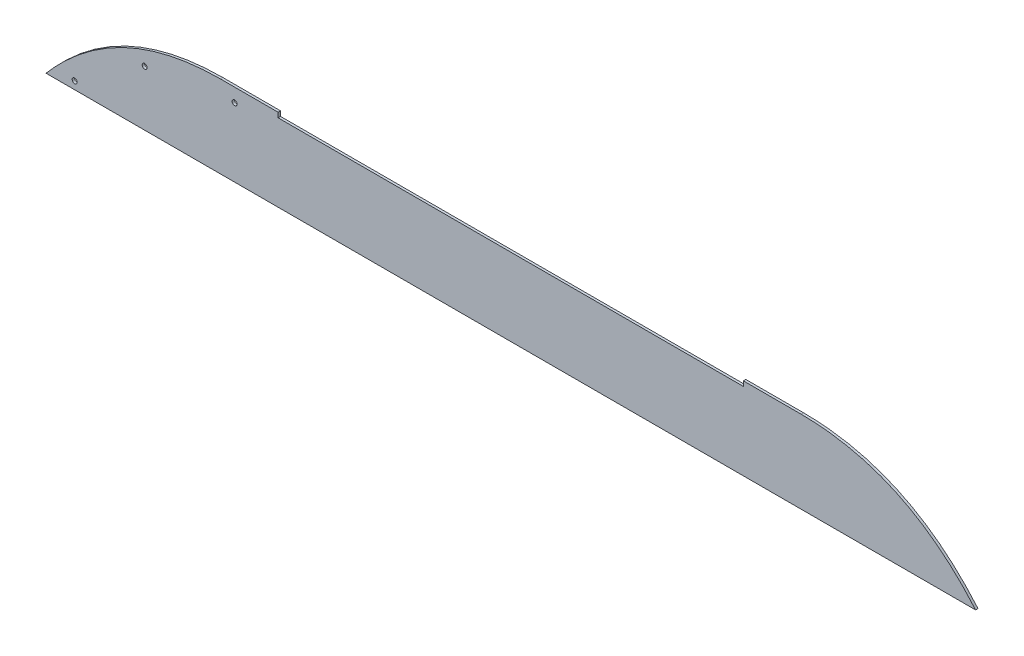
ISO-10303-21;
HEADER;
FILE_DESCRIPTION(('STEP AP214'),'2;1');
FILE_NAME('part.step','',(''),(''),'','','');
FILE_SCHEMA(('AUTOMOTIVE_DESIGN { 1 0 10303 214 1 1 1 1 }'));
ENDSEC;
DATA;
#1=APPLICATION_CONTEXT('core data for automotive mechanical design processes');
#2=APPLICATION_PROTOCOL_DEFINITION('international standard','automotive_design',2000,#1);
#3=PRODUCT_CONTEXT('',#1,'mechanical');
#4=PRODUCT('Part','Part','',(#3));
#5=PRODUCT_RELATED_PRODUCT_CATEGORY('part','',(#4));
#6=PRODUCT_DEFINITION_FORMATION('','',#4);
#7=PRODUCT_DEFINITION_CONTEXT('part definition',#1,'design');
#8=PRODUCT_DEFINITION('design','',#6,#7);
#9=PRODUCT_DEFINITION_SHAPE('','',#8);
#10=(LENGTH_UNIT() NAMED_UNIT(*) SI_UNIT(.MILLI.,.METRE.));
#11=(NAMED_UNIT(*) PLANE_ANGLE_UNIT() SI_UNIT($,.RADIAN.));
#12=(NAMED_UNIT(*) SI_UNIT($,.STERADIAN.) SOLID_ANGLE_UNIT());
#13=UNCERTAINTY_MEASURE_WITH_UNIT(LENGTH_MEASURE(1.E-05),#10,'distance_accuracy_value','');
#14=(GEOMETRIC_REPRESENTATION_CONTEXT(3) GLOBAL_UNCERTAINTY_ASSIGNED_CONTEXT((#13)) GLOBAL_UNIT_ASSIGNED_CONTEXT((#10,
#11,#12)) REPRESENTATION_CONTEXT('',''));
#15=CARTESIAN_POINT('',(0.,0.,0.));
#16=DIRECTION('',(0.,0.,1.));
#17=DIRECTION('',(1.,0.,0.));
#18=AXIS2_PLACEMENT_3D('',#15,#16,#17);
#19=CARTESIAN_POINT('',(-6.604,80.5502348528312,3.175));
#20=DIRECTION('',(0.,0.,1.));
#21=DIRECTION('',(1.,0.,0.));
#22=AXIS2_PLACEMENT_3D('',#19,#20,#21);
#23=PLANE('',#22);
#24=CARTESIAN_POINT('',(-57.404,90.1701915203067,3.175));
#25=DIRECTION('',(0.,0.,1.));
#26=DIRECTION('',(1.,0.,0.));
#27=AXIS2_PLACEMENT_3D('',#24,#25,#26);
#28=CIRCLE('',#27,3.27500000000001);
#29=CARTESIAN_POINT('',(-54.129,90.1701915203067,3.175));
#30=VERTEX_POINT('',#29);
#31=EDGE_CURVE('E164',#30,#30,#28,.F.);
#32=ORIENTED_EDGE('',*,*,#31,.T.);
#33=EDGE_LOOP('',(#32));
#34=FACE_BOUND('',#33,.T.);
#35=CARTESIAN_POINT('',(-267.208000000189,10.1599999999449,3.175));
#36=DIRECTION('',(0.,0.,1.));
#37=DIRECTION('',(1.,0.,0.));
#38=AXIS2_PLACEMENT_3D('',#35,#36,#37);
#39=CIRCLE('',#38,3.27499999999996);
#40=CARTESIAN_POINT('',(-263.933000000189,10.1599999999449,3.175));
#41=VERTEX_POINT('',#40);
#42=EDGE_CURVE('E155',#41,#41,#39,.F.);
#43=ORIENTED_EDGE('',*,*,#42,.T.);
#44=EDGE_LOOP('',(#43));
#45=FACE_BOUND('',#44,.T.);
#46=CARTESIAN_POINT('',(-76.2,107.95,3.175));
#47=CARTESIAN_POINT('',(-213.403997346706,107.359981336517,3.175));
#48=CARTESIAN_POINT('',(-304.8,0.,3.175));
#49=B_SPLINE_CURVE_WITH_KNOTS('',2,(#46,#47,#48),.UNSPECIFIED.,.F.,.F.,(3,3),(0.,1.),.UNSPECIFIED.);
#50=CARTESIAN_POINT('',(-76.2,107.95,3.175));
#51=VERTEX_POINT('',#50);
#52=CARTESIAN_POINT('',(-304.8,0.,3.175));
#53=VERTEX_POINT('',#52);
#54=EDGE_CURVE('E149',#51,#53,#49,.T.);
#55=ORIENTED_EDGE('',*,*,#54,.T.);
#56=DIRECTION('',(1.,0.,0.));
#57=VECTOR('',#56,1.);
#58=CARTESIAN_POINT('',(0.,0.,3.175));
#59=LINE('',#58,#57);
#60=CARTESIAN_POINT('',(914.4,0.,3.175));
#61=VERTEX_POINT('',#60);
#62=EDGE_CURVE('E133',#53,#61,#59,.T.);
#63=ORIENTED_EDGE('',*,*,#62,.T.);
#64=CARTESIAN_POINT('',(914.4,0.,3.175));
#65=CARTESIAN_POINT('',(823.003997346706,107.359981336517,3.175));
#66=CARTESIAN_POINT('',(685.8,107.95,3.175));
#67=B_SPLINE_CURVE_WITH_KNOTS('',2,(#64,#65,#66),.UNSPECIFIED.,.F.,.F.,(3,3),(0.,1.),.UNSPECIFIED.);
#68=CARTESIAN_POINT('',(685.8,107.95,3.175));
#69=VERTEX_POINT('',#68);
#70=EDGE_CURVE('E126',#61,#69,#67,.T.);
#71=ORIENTED_EDGE('',*,*,#70,.T.);
#72=DIRECTION('',(-1.,0.,0.));
#73=VECTOR('',#72,1.);
#74=CARTESIAN_POINT('',(609.6,107.95,3.175));
#75=LINE('',#74,#73);
#76=CARTESIAN_POINT('',(609.854,107.95,3.175));
#77=VERTEX_POINT('',#76);
#78=EDGE_CURVE('E120',#69,#77,#75,.T.);
#79=ORIENTED_EDGE('',*,*,#78,.T.);
#80=DIRECTION('',(0.,1.,0.));
#81=VECTOR('',#80,1.);
#82=CARTESIAN_POINT('',(609.854,107.95,3.175));
#83=LINE('',#82,#81);
#84=CARTESIAN_POINT('',(609.854,101.6,3.175));
#85=VERTEX_POINT('',#84);
#86=EDGE_CURVE('E86',#85,#77,#83,.T.);
#87=ORIENTED_EDGE('',*,*,#86,.F.);
#88=DIRECTION('',(1.,0.,0.));
#89=VECTOR('',#88,1.);
#90=CARTESIAN_POINT('',(609.6,101.6,3.175));
#91=LINE('',#90,#89);
#92=CARTESIAN_POINT('',(-0.254,101.6,3.175));
#93=VERTEX_POINT('',#92);
#94=EDGE_CURVE('E174',#93,#85,#91,.T.);
#95=ORIENTED_EDGE('',*,*,#94,.F.);
#96=DIRECTION('',(0.,1.,0.));
#97=VECTOR('',#96,1.);
#98=CARTESIAN_POINT('',(-0.254,107.95,3.175));
#99=LINE('',#98,#97);
#100=CARTESIAN_POINT('',(-0.254,107.95,3.175));
#101=VERTEX_POINT('',#100);
#102=EDGE_CURVE('E167',#93,#101,#99,.T.);
#103=ORIENTED_EDGE('',*,*,#102,.T.);
#104=DIRECTION('',(-1.,0.,0.));
#105=VECTOR('',#104,1.);
#106=CARTESIAN_POINT('',(0.,107.95,3.175));
#107=LINE('',#106,#105);
#108=EDGE_CURVE('E97',#101,#51,#107,.T.);
#109=ORIENTED_EDGE('',*,*,#108,.T.);
#110=EDGE_LOOP('',(#55,#63,#71,#79,#87,#95,#103,#109));
#111=FACE_BOUND('',#110,.T.);
#112=CARTESIAN_POINT('',(-175.365808452393,72.6222695788124,3.175));
#113=DIRECTION('',(0.,0.,1.));
#114=DIRECTION('',(1.,0.,0.));
#115=AXIS2_PLACEMENT_3D('',#112,#113,#114);
#116=CIRCLE('',#115,3.27499999999999);
#117=CARTESIAN_POINT('',(-172.090808452393,72.6222695788124,3.175));
#118=VERTEX_POINT('',#117);
#119=EDGE_CURVE('E161',#118,#118,#116,.F.);
#120=ORIENTED_EDGE('',*,*,#119,.T.);
#121=EDGE_LOOP('',(#120));
#122=FACE_BOUND('',#121,.T.);
#123=ADVANCED_FACE('F39',(#34,#45,#111,#122),#23,.T.);
#124=CARTESIAN_POINT('',(0.,107.95,3.175));
#125=DIRECTION('',(0.,-1.,0.));
#126=DIRECTION('',(1.,0.,0.));
#127=AXIS2_PLACEMENT_3D('',#124,#125,#126);
#128=PLANE('',#127);
#129=ORIENTED_EDGE('',*,*,#108,.F.);
#130=DIRECTION('',(0.,0.,1.));
#131=VECTOR('',#130,1.);
#132=CARTESIAN_POINT('',(-0.254,107.95,0.));
#133=LINE('',#132,#131);
#134=CARTESIAN_POINT('',(-0.254,107.95,0.));
#135=VERTEX_POINT('',#134);
#136=EDGE_CURVE('E43',#135,#101,#133,.T.);
#137=ORIENTED_EDGE('',*,*,#136,.F.);
#138=DIRECTION('',(-1.,0.,0.));
#139=VECTOR('',#138,1.);
#140=CARTESIAN_POINT('',(0.,107.95,0.));
#141=LINE('',#140,#139);
#142=CARTESIAN_POINT('',(-76.2,107.95,0.));
#143=VERTEX_POINT('',#142);
#144=EDGE_CURVE('E94',#135,#143,#141,.T.);
#145=ORIENTED_EDGE('',*,*,#144,.T.);
#146=DIRECTION('',(0.,0.,-1.));
#147=VECTOR('',#146,1.);
#148=CARTESIAN_POINT('',(-76.2,107.95,3.175));
#149=LINE('',#148,#147);
#150=EDGE_CURVE('E225',#51,#143,#149,.T.);
#151=ORIENTED_EDGE('',*,*,#150,.F.);
#152=EDGE_LOOP('',(#129,#137,#145,#151));
#153=FACE_BOUND('',#152,.T.);
#154=ADVANCED_FACE('F91',(#153),#128,.F.);
#155=CARTESIAN_POINT('',(0.,0.,3.175));
#156=DIRECTION('',(0.,1.,0.));
#157=DIRECTION('',(-1.,0.,0.));
#158=AXIS2_PLACEMENT_3D('',#155,#156,#157);
#159=PLANE('',#158);
#160=ORIENTED_EDGE('',*,*,#62,.F.);
#161=DIRECTION('',(0.,0.,-1.));
#162=VECTOR('',#161,1.);
#163=CARTESIAN_POINT('',(-304.8,0.,3.175));
#164=LINE('',#163,#162);
#165=CARTESIAN_POINT('',(-304.8,0.,0.));
#166=VERTEX_POINT('',#165);
#167=EDGE_CURVE('E127',#53,#166,#164,.T.);
#168=ORIENTED_EDGE('',*,*,#167,.T.);
#169=DIRECTION('',(1.,0.,0.));
#170=VECTOR('',#169,1.);
#171=CARTESIAN_POINT('',(0.,0.,0.));
#172=LINE('',#171,#170);
#173=CARTESIAN_POINT('',(914.4,0.,0.));
#174=VERTEX_POINT('',#173);
#175=EDGE_CURVE('E216',#166,#174,#172,.T.);
#176=ORIENTED_EDGE('',*,*,#175,.T.);
#177=DIRECTION('',(0.,0.,-1.));
#178=VECTOR('',#177,1.);
#179=CARTESIAN_POINT('',(914.4,0.,3.175));
#180=LINE('',#179,#178);
#181=EDGE_CURVE('E170',#61,#174,#180,.T.);
#182=ORIENTED_EDGE('',*,*,#181,.F.);
#183=EDGE_LOOP('',(#160,#168,#176,#182));
#184=FACE_BOUND('',#183,.T.);
#185=ADVANCED_FACE('F218',(#184),#159,.F.);
#186=CARTESIAN_POINT('',(-0.254,107.95,0.));
#187=DIRECTION('',(-1.,0.,0.));
#188=DIRECTION('',(0.,0.,1.));
#189=AXIS2_PLACEMENT_3D('',#186,#187,#188);
#190=PLANE('',#189);
#191=ORIENTED_EDGE('',*,*,#102,.F.);
#192=DIRECTION('',(0.,0.,1.));
#193=VECTOR('',#192,1.);
#194=CARTESIAN_POINT('',(-0.254,101.6,0.));
#195=LINE('',#194,#193);
#196=CARTESIAN_POINT('',(-0.253999999999976,101.6,0.));
#197=VERTEX_POINT('',#196);
#198=EDGE_CURVE('E82',#197,#93,#195,.T.);
#199=ORIENTED_EDGE('',*,*,#198,.F.);
#200=DIRECTION('',(0.,-1.,0.));
#201=VECTOR('',#200,1.);
#202=CARTESIAN_POINT('',(-0.254,107.95,0.));
#203=LINE('',#202,#201);
#204=EDGE_CURVE('E74',#135,#197,#203,.T.);
#205=ORIENTED_EDGE('',*,*,#204,.F.);
#206=ORIENTED_EDGE('',*,*,#136,.T.);
#207=EDGE_LOOP('',(#191,#199,#205,#206));
#208=FACE_BOUND('',#207,.T.);
#209=ADVANCED_FACE('F77',(#208),#190,.F.);
#210=CARTESIAN_POINT('',(-57.404,90.1701915203067,0.));
#211=DIRECTION('',(0.,0.,1.));
#212=DIRECTION('',(1.,0.,0.));
#213=AXIS2_PLACEMENT_3D('',#210,#211,#212);
#214=CYLINDRICAL_SURFACE('',#213,3.27500000000001);
#215=CARTESIAN_POINT('',(-57.404,90.1701915203067,0.));
#216=DIRECTION('',(0.,0.,1.));
#217=DIRECTION('',(1.,0.,0.));
#218=AXIS2_PLACEMENT_3D('',#215,#216,#217);
#219=CIRCLE('',#218,3.27500000000001);
#220=CARTESIAN_POINT('',(-54.129,90.1701915203067,0.));
#221=VERTEX_POINT('',#220);
#222=EDGE_CURVE('E11',#221,#221,#219,.T.);
#223=ORIENTED_EDGE('',*,*,#222,.F.);
#224=EDGE_LOOP('',(#223));
#225=FACE_BOUND('',#224,.T.);
#226=ORIENTED_EDGE('',*,*,#31,.F.);
#227=EDGE_LOOP('',(#226));
#228=FACE_BOUND('',#227,.T.);
#229=ADVANCED_FACE('F41',(#225,#228),#214,.F.);
#230=CARTESIAN_POINT('',(-175.365808452393,72.6222695788124,0.));
#231=DIRECTION('',(0.,0.,1.));
#232=DIRECTION('',(1.,0.,0.));
#233=AXIS2_PLACEMENT_3D('',#230,#231,#232);
#234=CYLINDRICAL_SURFACE('',#233,3.27499999999999);
#235=CARTESIAN_POINT('',(-175.365808452393,72.6222695788124,0.));
#236=DIRECTION('',(0.,0.,1.));
#237=DIRECTION('',(1.,0.,0.));
#238=AXIS2_PLACEMENT_3D('',#235,#236,#237);
#239=CIRCLE('',#238,3.27499999999999);
#240=CARTESIAN_POINT('',(-172.090808452393,72.6222695788124,0.));
#241=VERTEX_POINT('',#240);
#242=EDGE_CURVE('E49',#241,#241,#239,.T.);
#243=ORIENTED_EDGE('',*,*,#242,.F.);
#244=EDGE_LOOP('',(#243));
#245=FACE_BOUND('',#244,.T.);
#246=ORIENTED_EDGE('',*,*,#119,.F.);
#247=EDGE_LOOP('',(#246));
#248=FACE_BOUND('',#247,.T.);
#249=ADVANCED_FACE('F251',(#245,#248),#234,.F.);
#250=CARTESIAN_POINT('',(-267.208000000189,10.1599999999449,0.));
#251=DIRECTION('',(0.,0.,1.));
#252=DIRECTION('',(1.,0.,0.));
#253=AXIS2_PLACEMENT_3D('',#250,#251,#252);
#254=CYLINDRICAL_SURFACE('',#253,3.27499999999996);
#255=CARTESIAN_POINT('',(-267.208000000189,10.1599999999449,0.));
#256=DIRECTION('',(0.,0.,1.));
#257=DIRECTION('',(1.,0.,0.));
#258=AXIS2_PLACEMENT_3D('',#255,#256,#257);
#259=CIRCLE('',#258,3.27499999999996);
#260=CARTESIAN_POINT('',(-263.933000000189,10.1599999999449,0.));
#261=VERTEX_POINT('',#260);
#262=EDGE_CURVE('E171',#261,#261,#259,.T.);
#263=ORIENTED_EDGE('',*,*,#262,.F.);
#264=EDGE_LOOP('',(#263));
#265=FACE_BOUND('',#264,.T.);
#266=ORIENTED_EDGE('',*,*,#42,.F.);
#267=EDGE_LOOP('',(#266));
#268=FACE_BOUND('',#267,.T.);
#269=ADVANCED_FACE('F247',(#265,#268),#254,.F.);
#270=CARTESIAN_POINT('',(685.8,107.95,0.));
#271=VERTEX_POINT('',#270);
#272=CARTESIAN_POINT('',(609.854,107.95,0.));
#273=VERTEX_POINT('',#272);
#274=EDGE_CURVE('E107',#271,#273,#141,.T.);
#275=ORIENTED_EDGE('',*,*,#274,.T.);
#276=DIRECTION('',(0.,0.,1.));
#277=VECTOR('',#276,1.);
#278=CARTESIAN_POINT('',(609.854,107.95,0.));
#279=LINE('',#278,#277);
#280=EDGE_CURVE('E110',#273,#77,#279,.T.);
#281=ORIENTED_EDGE('',*,*,#280,.T.);
#282=ORIENTED_EDGE('',*,*,#78,.F.);
#283=DIRECTION('',(0.,0.,-1.));
#284=VECTOR('',#283,1.);
#285=CARTESIAN_POINT('',(685.8,107.95,3.175));
#286=LINE('',#285,#284);
#287=EDGE_CURVE('E220',#69,#271,#286,.T.);
#288=ORIENTED_EDGE('',*,*,#287,.T.);
#289=EDGE_LOOP('',(#275,#281,#282,#288));
#290=FACE_BOUND('',#289,.T.);
#291=ADVANCED_FACE('F143',(#290),#128,.F.);
#292=DIRECTION('',(0.,0.,-1.));
#293=VECTOR('',#292,1.);
#294=SURFACE_OF_LINEAR_EXTRUSION('',#67,#293);
#295=CARTESIAN_POINT('',(914.4,0.,0.));
#296=CARTESIAN_POINT('',(823.003997346706,107.359981336517,0.));
#297=CARTESIAN_POINT('',(685.8,107.95,0.));
#298=B_SPLINE_CURVE_WITH_KNOTS('',2,(#295,#296,#297),.UNSPECIFIED.,.F.,.F.,(3,3),(0.,1.),.UNSPECIFIED.);
#299=EDGE_CURVE('E106',#174,#271,#298,.T.);
#300=ORIENTED_EDGE('',*,*,#299,.T.);
#301=ORIENTED_EDGE('',*,*,#287,.F.);
#302=ORIENTED_EDGE('',*,*,#70,.F.);
#303=ORIENTED_EDGE('',*,*,#181,.T.);
#304=EDGE_LOOP('',(#300,#301,#302,#303));
#305=FACE_BOUND('',#304,.T.);
#306=ADVANCED_FACE('F139',(#305),#294,.F.);
#307=DIRECTION('',(0.,0.,-1.));
#308=VECTOR('',#307,1.);
#309=SURFACE_OF_LINEAR_EXTRUSION('',#49,#308);
#310=CARTESIAN_POINT('',(-76.2,107.95,0.));
#311=CARTESIAN_POINT('',(-213.403997346706,107.359981336517,0.));
#312=CARTESIAN_POINT('',(-304.8,0.,0.));
#313=B_SPLINE_CURVE_WITH_KNOTS('',2,(#310,#311,#312),.UNSPECIFIED.,.F.,.F.,(3,3),(0.,1.),.UNSPECIFIED.);
#314=EDGE_CURVE('E105',#143,#166,#313,.T.);
#315=ORIENTED_EDGE('',*,*,#314,.T.);
#316=ORIENTED_EDGE('',*,*,#167,.F.);
#317=ORIENTED_EDGE('',*,*,#54,.F.);
#318=ORIENTED_EDGE('',*,*,#150,.T.);
#319=EDGE_LOOP('',(#315,#316,#317,#318));
#320=FACE_BOUND('',#319,.T.);
#321=ADVANCED_FACE('F142',(#320),#309,.F.);
#322=CARTESIAN_POINT('',(811.551998673353,80.6674906682584,0.));
#323=DIRECTION('',(0.,0.,-1.));
#324=DIRECTION('',(-1.,0.,0.));
#325=AXIS2_PLACEMENT_3D('',#322,#323,#324);
#326=PLANE('',#325);
#327=ORIENTED_EDGE('',*,*,#262,.T.);
#328=EDGE_LOOP('',(#327));
#329=FACE_BOUND('',#328,.T.);
#330=ORIENTED_EDGE('',*,*,#242,.T.);
#331=EDGE_LOOP('',(#330));
#332=FACE_BOUND('',#331,.T.);
#333=ORIENTED_EDGE('',*,*,#222,.T.);
#334=EDGE_LOOP('',(#333));
#335=FACE_BOUND('',#334,.T.);
#336=DIRECTION('',(0.,1.,0.));
#337=VECTOR('',#336,1.);
#338=CARTESIAN_POINT('',(609.854,107.95,0.));
#339=LINE('',#338,#337);
#340=CARTESIAN_POINT('',(609.854,101.6,0.));
#341=VERTEX_POINT('',#340);
#342=EDGE_CURVE('E99',#341,#273,#339,.T.);
#343=ORIENTED_EDGE('',*,*,#342,.T.);
#344=ORIENTED_EDGE('',*,*,#274,.F.);
#345=ORIENTED_EDGE('',*,*,#299,.F.);
#346=ORIENTED_EDGE('',*,*,#175,.F.);
#347=ORIENTED_EDGE('',*,*,#314,.F.);
#348=ORIENTED_EDGE('',*,*,#144,.F.);
#349=ORIENTED_EDGE('',*,*,#204,.T.);
#350=DIRECTION('',(1.,0.,0.));
#351=VECTOR('',#350,1.);
#352=CARTESIAN_POINT('',(-0.254,101.6,0.));
#353=LINE('',#352,#351);
#354=EDGE_CURVE('E87',#197,#341,#353,.T.);
#355=ORIENTED_EDGE('',*,*,#354,.T.);
#356=EDGE_LOOP('',(#343,#344,#345,#346,#347,#348,#349,#355));
#357=FACE_BOUND('',#356,.T.);
#358=ADVANCED_FACE('F102',(#329,#332,#335,#357),#326,.T.);
#359=CARTESIAN_POINT('',(609.854,107.95,0.));
#360=DIRECTION('',(1.,0.,0.));
#361=DIRECTION('',(0.,0.,-1.));
#362=AXIS2_PLACEMENT_3D('',#359,#360,#361);
#363=PLANE('',#362);
#364=ORIENTED_EDGE('',*,*,#86,.T.);
#365=ORIENTED_EDGE('',*,*,#280,.F.);
#366=ORIENTED_EDGE('',*,*,#342,.F.);
#367=DIRECTION('',(0.,0.,1.));
#368=VECTOR('',#367,1.);
#369=CARTESIAN_POINT('',(609.854,101.6,0.));
#370=LINE('',#369,#368);
#371=EDGE_CURVE('E58',#341,#85,#370,.T.);
#372=ORIENTED_EDGE('',*,*,#371,.T.);
#373=EDGE_LOOP('',(#364,#365,#366,#372));
#374=FACE_BOUND('',#373,.T.);
#375=ADVANCED_FACE('F227',(#374),#363,.F.);
#376=CARTESIAN_POINT('',(609.6,101.6,0.));
#377=DIRECTION('',(0.,-1.,0.));
#378=DIRECTION('',(0.,0.,-1.));
#379=AXIS2_PLACEMENT_3D('',#376,#377,#378);
#380=PLANE('',#379);
#381=ORIENTED_EDGE('',*,*,#94,.T.);
#382=ORIENTED_EDGE('',*,*,#371,.F.);
#383=ORIENTED_EDGE('',*,*,#354,.F.);
#384=ORIENTED_EDGE('',*,*,#198,.T.);
#385=EDGE_LOOP('',(#381,#382,#383,#384));
#386=FACE_BOUND('',#385,.T.);
#387=ADVANCED_FACE('F184',(#386),#380,.F.);
#388=CLOSED_SHELL('',(#123,#154,#185,#209,#229,#249,#269,#291,#306,#321,#358,#375,#387));
#389=MANIFOLD_SOLID_BREP('B2',#388);
#390=ADVANCED_BREP_SHAPE_REPRESENTATION('',(#18,#389),#14);
#391=SHAPE_DEFINITION_REPRESENTATION(#9,#390);
ENDSEC;
END-ISO-10303-21;
